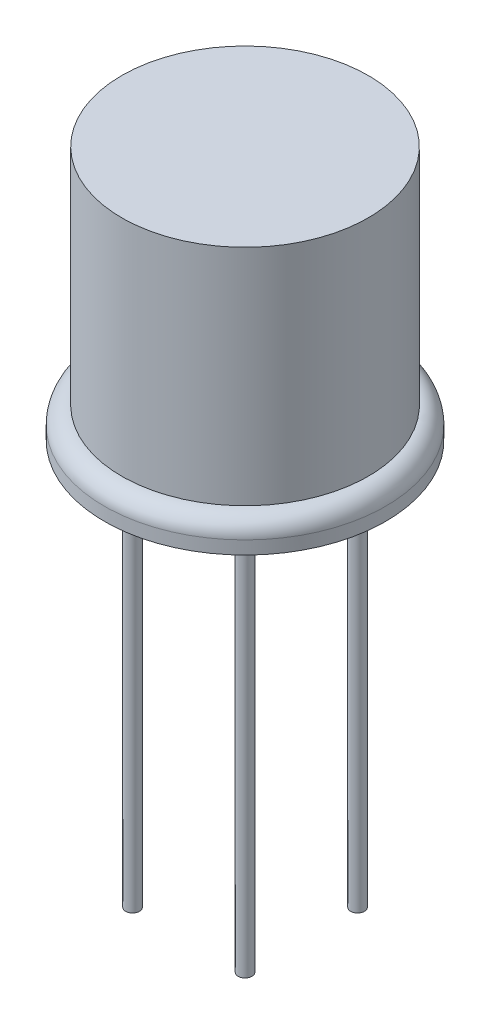
ISO-10303-21;
HEADER;
FILE_DESCRIPTION(('STEP AP214'),'2;1');
FILE_NAME('part.step','',(''),(''),'','','');
FILE_SCHEMA(('AUTOMOTIVE_DESIGN { 1 0 10303 214 1 1 1 1 }'));
ENDSEC;
DATA;
#1=APPLICATION_CONTEXT('core data for automotive mechanical design processes');
#2=APPLICATION_PROTOCOL_DEFINITION('international standard','automotive_design',2000,#1);
#3=PRODUCT_CONTEXT('',#1,'mechanical');
#4=PRODUCT('Part','Part','',(#3));
#5=PRODUCT_RELATED_PRODUCT_CATEGORY('part','',(#4));
#6=PRODUCT_DEFINITION_FORMATION('','',#4);
#7=PRODUCT_DEFINITION_CONTEXT('part definition',#1,'design');
#8=PRODUCT_DEFINITION('design','',#6,#7);
#9=PRODUCT_DEFINITION_SHAPE('','',#8);
#10=(LENGTH_UNIT() NAMED_UNIT(*) SI_UNIT(.MILLI.,.METRE.));
#11=(NAMED_UNIT(*) PLANE_ANGLE_UNIT() SI_UNIT($,.RADIAN.));
#12=(NAMED_UNIT(*) SI_UNIT($,.STERADIAN.) SOLID_ANGLE_UNIT());
#13=UNCERTAINTY_MEASURE_WITH_UNIT(LENGTH_MEASURE(1.E-05),#10,'distance_accuracy_value','');
#14=(GEOMETRIC_REPRESENTATION_CONTEXT(3) GLOBAL_UNCERTAINTY_ASSIGNED_CONTEXT((#13)) GLOBAL_UNIT_ASSIGNED_CONTEXT((#10,
#11,#12)) REPRESENTATION_CONTEXT('',''));
#15=CARTESIAN_POINT('',(0.,0.,0.));
#16=DIRECTION('',(0.,0.,1.));
#17=DIRECTION('',(1.,0.,0.));
#18=AXIS2_PLACEMENT_3D('',#15,#16,#17);
#19=CARTESIAN_POINT('',(0.,0.4318,0.));
#20=DIRECTION('',(0.,1.,0.));
#21=DIRECTION('',(0.,0.,1.));
#22=AXIS2_PLACEMENT_3D('',#19,#20,#21);
#23=PLANE('',#22);
#24=DIRECTION('',(0.,0.,1.));
#25=VECTOR('',#24,1.);
#26=CARTESIAN_POINT('',(-0.4445,0.4318,-4.61413913964458));
#27=LINE('',#26,#25);
#28=CARTESIAN_POINT('',(-0.4445,0.4318,-5.24913913964458));
#29=VERTEX_POINT('',#28);
#30=CARTESIAN_POINT('',(-0.4445,0.4318,-4.61413913964458));
#31=VERTEX_POINT('',#30);
#32=EDGE_CURVE('E63',#29,#31,#27,.T.);
#33=ORIENTED_EDGE('',*,*,#32,.T.);
#34=CARTESIAN_POINT('',(0.,0.4318,0.));
#35=DIRECTION('',(0.,1.,0.));
#36=DIRECTION('',(-1.,0.,0.));
#37=AXIS2_PLACEMENT_3D('',#34,#35,#36);
#38=CIRCLE('',#37,4.6355);
#39=CARTESIAN_POINT('',(0.4445,0.4318,-4.61413913964458));
#40=VERTEX_POINT('',#39);
#41=EDGE_CURVE('E114',#40,#31,#38,.T.);
#42=ORIENTED_EDGE('',*,*,#41,.F.);
#43=DIRECTION('',(0.,0.,-1.));
#44=VECTOR('',#43,1.);
#45=CARTESIAN_POINT('',(0.4445,0.4318,-5.24913913964458));
#46=LINE('',#45,#44);
#47=CARTESIAN_POINT('',(0.4445,0.4318,-5.24913913964458));
#48=VERTEX_POINT('',#47);
#49=EDGE_CURVE('E90',#40,#48,#46,.T.);
#50=ORIENTED_EDGE('',*,*,#49,.T.);
#51=DIRECTION('',(-1.,0.,0.));
#52=VECTOR('',#51,1.);
#53=CARTESIAN_POINT('',(-0.4445,0.4318,-5.24913913964458));
#54=LINE('',#53,#52);
#55=EDGE_CURVE('E112',#48,#29,#54,.T.);
#56=ORIENTED_EDGE('',*,*,#55,.T.);
#57=EDGE_LOOP('',(#33,#42,#50,#56));
#58=FACE_BOUND('',#57,.T.);
#59=ADVANCED_FACE('F45',(#58),#23,.T.);
#60=CARTESIAN_POINT('',(0.,0.4318,0.));
#61=DIRECTION('',(0.,-1.,0.));
#62=DIRECTION('',(0.,0.,-1.));
#63=AXIS2_PLACEMENT_3D('',#60,#61,#62);
#64=CYLINDRICAL_SURFACE('',#63,4.6355);
#65=CARTESIAN_POINT('',(0.,0.,0.));
#66=DIRECTION('',(0.,1.,0.));
#67=DIRECTION('',(0.,0.,1.));
#68=AXIS2_PLACEMENT_3D('',#65,#66,#67);
#69=CIRCLE('',#68,4.6355);
#70=CARTESIAN_POINT('',(-0.4445,0.,-4.61413913964458));
#71=VERTEX_POINT('',#70);
#72=CARTESIAN_POINT('',(0.4445,0.,-4.61413913964458));
#73=VERTEX_POINT('',#72);
#74=EDGE_CURVE('E103',#71,#73,#69,.T.);
#75=ORIENTED_EDGE('',*,*,#74,.T.);
#76=DIRECTION('',(0.,-1.,0.));
#77=VECTOR('',#76,1.);
#78=CARTESIAN_POINT('',(0.4445,0.4318,-4.61413913964458));
#79=LINE('',#78,#77);
#80=EDGE_CURVE('E98',#40,#73,#79,.T.);
#81=ORIENTED_EDGE('',*,*,#80,.F.);
#82=CARTESIAN_POINT('',(0.,0.4318,0.));
#83=DIRECTION('',(0.,1.,0.));
#84=DIRECTION('',(0.,0.,1.));
#85=AXIS2_PLACEMENT_3D('',#82,#83,#84);
#86=CIRCLE('',#85,4.6355);
#87=EDGE_CURVE('E100',#31,#40,#86,.T.);
#88=ORIENTED_EDGE('',*,*,#87,.F.);
#89=DIRECTION('',(0.,-1.,0.));
#90=VECTOR('',#89,1.);
#91=CARTESIAN_POINT('',(-0.4445,0.4318,-4.61413913964458));
#92=LINE('',#91,#90);
#93=EDGE_CURVE('E133',#31,#71,#92,.T.);
#94=ORIENTED_EDGE('',*,*,#93,.T.);
#95=EDGE_LOOP('',(#75,#81,#88,#94));
#96=FACE_BOUND('',#95,.T.);
#97=ADVANCED_FACE('F47',(#96),#64,.T.);
#98=CARTESIAN_POINT('',(0.4445,0.4318,-5.24913913964458));
#99=DIRECTION('',(-1.,0.,0.));
#100=DIRECTION('',(0.,0.,1.));
#101=AXIS2_PLACEMENT_3D('',#98,#99,#100);
#102=PLANE('',#101);
#103=DIRECTION('',(0.,0.,-1.));
#104=VECTOR('',#103,1.);
#105=CARTESIAN_POINT('',(0.4445,0.,-5.24913913964458));
#106=LINE('',#105,#104);
#107=CARTESIAN_POINT('',(0.4445,0.,-5.24913913964458));
#108=VERTEX_POINT('',#107);
#109=EDGE_CURVE('E136',#73,#108,#106,.T.);
#110=ORIENTED_EDGE('',*,*,#109,.T.);
#111=DIRECTION('',(0.,-1.,0.));
#112=VECTOR('',#111,1.);
#113=CARTESIAN_POINT('',(0.4445,0.4318,-5.24913913964458));
#114=LINE('',#113,#112);
#115=EDGE_CURVE('E107',#48,#108,#114,.T.);
#116=ORIENTED_EDGE('',*,*,#115,.F.);
#117=ORIENTED_EDGE('',*,*,#49,.F.);
#118=ORIENTED_EDGE('',*,*,#80,.T.);
#119=EDGE_LOOP('',(#110,#116,#117,#118));
#120=FACE_BOUND('',#119,.T.);
#121=ADVANCED_FACE('F109',(#120),#102,.F.);
#122=CARTESIAN_POINT('',(-0.4445,0.4318,-5.24913913964458));
#123=DIRECTION('',(0.,0.,1.));
#124=DIRECTION('',(1.,0.,0.));
#125=AXIS2_PLACEMENT_3D('',#122,#123,#124);
#126=PLANE('',#125);
#127=DIRECTION('',(-1.,0.,0.));
#128=VECTOR('',#127,1.);
#129=CARTESIAN_POINT('',(-0.4445,0.,-5.24913913964458));
#130=LINE('',#129,#128);
#131=CARTESIAN_POINT('',(-0.4445,0.,-5.24913913964458));
#132=VERTEX_POINT('',#131);
#133=EDGE_CURVE('E81',#108,#132,#130,.T.);
#134=ORIENTED_EDGE('',*,*,#133,.T.);
#135=DIRECTION('',(0.,-1.,0.));
#136=VECTOR('',#135,1.);
#137=CARTESIAN_POINT('',(-0.4445,0.4318,-5.24913913964458));
#138=LINE('',#137,#136);
#139=EDGE_CURVE('E143',#29,#132,#138,.T.);
#140=ORIENTED_EDGE('',*,*,#139,.F.);
#141=ORIENTED_EDGE('',*,*,#55,.F.);
#142=ORIENTED_EDGE('',*,*,#115,.T.);
#143=EDGE_LOOP('',(#134,#140,#141,#142));
#144=FACE_BOUND('',#143,.T.);
#145=ADVANCED_FACE('F170',(#144),#126,.F.);
#146=CARTESIAN_POINT('',(-0.4445,0.4318,-4.61413913964458));
#147=DIRECTION('',(1.,0.,0.));
#148=DIRECTION('',(0.,0.,-1.));
#149=AXIS2_PLACEMENT_3D('',#146,#147,#148);
#150=PLANE('',#149);
#151=DIRECTION('',(0.,0.,1.));
#152=VECTOR('',#151,1.);
#153=CARTESIAN_POINT('',(-0.4445,0.,-4.61413913964458));
#154=LINE('',#153,#152);
#155=EDGE_CURVE('E86',#132,#71,#154,.T.);
#156=ORIENTED_EDGE('',*,*,#155,.T.);
#157=ORIENTED_EDGE('',*,*,#93,.F.);
#158=ORIENTED_EDGE('',*,*,#32,.F.);
#159=ORIENTED_EDGE('',*,*,#139,.T.);
#160=EDGE_LOOP('',(#156,#157,#158,#159));
#161=FACE_BOUND('',#160,.T.);
#162=ADVANCED_FACE('F163',(#161),#150,.F.);
#163=CARTESIAN_POINT('',(0.,0.,0.));
#164=DIRECTION('',(0.,1.,0.));
#165=DIRECTION('',(0.,0.,1.));
#166=AXIS2_PLACEMENT_3D('',#163,#164,#165);
#167=PLANE('',#166);
#168=CARTESIAN_POINT('',(-1.8542,0.,1.8542));
#169=DIRECTION('',(0.,1.,0.));
#170=DIRECTION('',(0.,0.,1.));
#171=AXIS2_PLACEMENT_3D('',#168,#169,#170);
#172=CIRCLE('',#171,0.2286);
#173=CARTESIAN_POINT('',(-1.8542,0.,2.0828));
#174=VERTEX_POINT('',#173);
#175=EDGE_CURVE('E12',#174,#174,#172,.F.);
#176=ORIENTED_EDGE('',*,*,#175,.F.);
#177=EDGE_LOOP('',(#176));
#178=FACE_BOUND('',#177,.T.);
#179=CARTESIAN_POINT('',(1.8542,0.,1.8542));
#180=DIRECTION('',(0.,1.,0.));
#181=DIRECTION('',(0.,0.,1.));
#182=AXIS2_PLACEMENT_3D('',#179,#180,#181);
#183=CIRCLE('',#182,0.2286);
#184=CARTESIAN_POINT('',(1.8542,0.,2.0828));
#185=VERTEX_POINT('',#184);
#186=EDGE_CURVE('E55',#185,#185,#183,.F.);
#187=ORIENTED_EDGE('',*,*,#186,.F.);
#188=EDGE_LOOP('',(#187));
#189=FACE_BOUND('',#188,.T.);
#190=CARTESIAN_POINT('',(1.8542,0.,-1.8542));
#191=DIRECTION('',(0.,1.,0.));
#192=DIRECTION('',(0.,0.,1.));
#193=AXIS2_PLACEMENT_3D('',#190,#191,#192);
#194=CIRCLE('',#193,0.2286);
#195=CARTESIAN_POINT('',(1.8542,0.,-1.6256));
#196=VERTEX_POINT('',#195);
#197=EDGE_CURVE('E151',#196,#196,#194,.F.);
#198=ORIENTED_EDGE('',*,*,#197,.F.);
#199=EDGE_LOOP('',(#198));
#200=FACE_BOUND('',#199,.T.);
#201=CARTESIAN_POINT('',(-1.8542,0.,-1.8542));
#202=DIRECTION('',(0.,1.,0.));
#203=DIRECTION('',(0.,0.,1.));
#204=AXIS2_PLACEMENT_3D('',#201,#202,#203);
#205=CIRCLE('',#204,0.2286);
#206=CARTESIAN_POINT('',(-1.8542,0.,-1.6256));
#207=VERTEX_POINT('',#206);
#208=EDGE_CURVE('E106',#207,#207,#205,.F.);
#209=ORIENTED_EDGE('',*,*,#208,.F.);
#210=EDGE_LOOP('',(#209));
#211=FACE_BOUND('',#210,.T.);
#212=ORIENTED_EDGE('',*,*,#74,.F.);
#213=ORIENTED_EDGE('',*,*,#155,.F.);
#214=ORIENTED_EDGE('',*,*,#133,.F.);
#215=ORIENTED_EDGE('',*,*,#109,.F.);
#216=EDGE_LOOP('',(#212,#213,#214,#215));
#217=FACE_BOUND('',#216,.T.);
#218=ADVANCED_FACE('F160',(#178,#189,#200,#211,#217),#167,.F.);
#219=CARTESIAN_POINT('',(0.,0.4318,0.));
#220=DIRECTION('',(0.,1.,0.));
#221=DIRECTION('',(-1.,0.,0.));
#222=AXIS2_PLACEMENT_3D('',#219,#220,#221);
#223=TOROIDAL_SURFACE('',#222,4.064,0.5715);
#224=CARTESIAN_POINT('',(0.,1.0033,0.));
#225=DIRECTION('',(0.,1.,0.));
#226=DIRECTION('',(-1.,0.,0.));
#227=AXIS2_PLACEMENT_3D('',#224,#225,#226);
#228=CIRCLE('',#227,4.064);
#229=CARTESIAN_POINT('',(-4.064,1.0033,0.));
#230=VERTEX_POINT('',#229);
#231=EDGE_CURVE('E126',#230,#230,#228,.T.);
#232=ORIENTED_EDGE('',*,*,#231,.F.);
#233=EDGE_LOOP('',(#232));
#234=FACE_BOUND('',#233,.T.);
#235=ORIENTED_EDGE('',*,*,#41,.T.);
#236=ORIENTED_EDGE('',*,*,#87,.T.);
#237=EDGE_LOOP('',(#235,#236));
#238=FACE_BOUND('',#237,.T.);
#239=ADVANCED_FACE('F120',(#234,#238),#223,.T.);
#240=CARTESIAN_POINT('',(0.,8.382,0.));
#241=DIRECTION('',(0.,1.,0.));
#242=DIRECTION('',(-1.,0.,0.));
#243=AXIS2_PLACEMENT_3D('',#240,#241,#242);
#244=CYLINDRICAL_SURFACE('',#243,4.064);
#245=CARTESIAN_POINT('',(0.,8.382,0.));
#246=DIRECTION('',(0.,1.,0.));
#247=DIRECTION('',(-1.,0.,0.));
#248=AXIS2_PLACEMENT_3D('',#245,#246,#247);
#249=CIRCLE('',#248,4.064);
#250=CARTESIAN_POINT('',(-4.064,8.382,0.));
#251=VERTEX_POINT('',#250);
#252=EDGE_CURVE('E117',#251,#251,#249,.T.);
#253=ORIENTED_EDGE('',*,*,#252,.F.);
#254=EDGE_LOOP('',(#253));
#255=FACE_BOUND('',#254,.T.);
#256=ORIENTED_EDGE('',*,*,#231,.T.);
#257=EDGE_LOOP('',(#256));
#258=FACE_BOUND('',#257,.T.);
#259=ADVANCED_FACE('F185',(#255,#258),#244,.T.);
#260=CARTESIAN_POINT('',(4.064,8.382,0.));
#261=DIRECTION('',(0.,-1.,0.));
#262=DIRECTION('',(1.,0.,0.));
#263=AXIS2_PLACEMENT_3D('',#260,#261,#262);
#264=PLANE('',#263);
#265=ORIENTED_EDGE('',*,*,#252,.T.);
#266=EDGE_LOOP('',(#265));
#267=FACE_BOUND('',#266,.T.);
#268=ADVANCED_FACE('F189',(#267),#264,.F.);
#269=CARTESIAN_POINT('',(-1.8542,-13.335,-1.8542));
#270=DIRECTION('',(0.,1.,0.));
#271=DIRECTION('',(0.,0.,1.));
#272=AXIS2_PLACEMENT_3D('',#269,#270,#271);
#273=CYLINDRICAL_SURFACE('',#272,0.2286);
#274=CARTESIAN_POINT('',(-1.8542,-13.335,-1.8542));
#275=DIRECTION('',(0.,-1.,0.));
#276=DIRECTION('',(0.,0.,-1.));
#277=AXIS2_PLACEMENT_3D('',#274,#275,#276);
#278=CIRCLE('',#277,0.2286);
#279=CARTESIAN_POINT('',(-1.8542,-13.335,-2.0828));
#280=VERTEX_POINT('',#279);
#281=EDGE_CURVE('E118',#280,#280,#278,.T.);
#282=ORIENTED_EDGE('',*,*,#281,.F.);
#283=EDGE_LOOP('',(#282));
#284=FACE_BOUND('',#283,.T.);
#285=ORIENTED_EDGE('',*,*,#208,.T.);
#286=EDGE_LOOP('',(#285));
#287=FACE_BOUND('',#286,.T.);
#288=ADVANCED_FACE('F193',(#284,#287),#273,.T.);
#289=CARTESIAN_POINT('',(-1.8542,-13.335,-1.8542));
#290=DIRECTION('',(0.,-1.,0.));
#291=DIRECTION('',(0.,0.,-1.));
#292=AXIS2_PLACEMENT_3D('',#289,#290,#291);
#293=PLANE('',#292);
#294=ORIENTED_EDGE('',*,*,#281,.T.);
#295=EDGE_LOOP('',(#294));
#296=FACE_BOUND('',#295,.T.);
#297=ADVANCED_FACE('F197',(#296),#293,.T.);
#298=CARTESIAN_POINT('',(1.8542,-13.335,-1.8542));
#299=DIRECTION('',(0.,1.,0.));
#300=DIRECTION('',(0.,0.,1.));
#301=AXIS2_PLACEMENT_3D('',#298,#299,#300);
#302=CYLINDRICAL_SURFACE('',#301,0.2286);
#303=CARTESIAN_POINT('',(1.8542,-13.335,-1.8542));
#304=DIRECTION('',(0.,-1.,0.));
#305=DIRECTION('',(0.,0.,-1.));
#306=AXIS2_PLACEMENT_3D('',#303,#304,#305);
#307=CIRCLE('',#306,0.2286);
#308=CARTESIAN_POINT('',(1.8542,-13.335,-2.0828));
#309=VERTEX_POINT('',#308);
#310=EDGE_CURVE('E229',#309,#309,#307,.T.);
#311=ORIENTED_EDGE('',*,*,#310,.F.);
#312=EDGE_LOOP('',(#311));
#313=FACE_BOUND('',#312,.T.);
#314=ORIENTED_EDGE('',*,*,#197,.T.);
#315=EDGE_LOOP('',(#314));
#316=FACE_BOUND('',#315,.T.);
#317=ADVANCED_FACE('F201',(#313,#316),#302,.T.);
#318=CARTESIAN_POINT('',(1.8542,-13.335,-1.8542));
#319=DIRECTION('',(0.,-1.,0.));
#320=DIRECTION('',(0.,0.,-1.));
#321=AXIS2_PLACEMENT_3D('',#318,#319,#320);
#322=PLANE('',#321);
#323=ORIENTED_EDGE('',*,*,#310,.T.);
#324=EDGE_LOOP('',(#323));
#325=FACE_BOUND('',#324,.T.);
#326=ADVANCED_FACE('F217',(#325),#322,.T.);
#327=CARTESIAN_POINT('',(1.8542,-13.335,1.8542));
#328=DIRECTION('',(0.,1.,0.));
#329=DIRECTION('',(0.,0.,1.));
#330=AXIS2_PLACEMENT_3D('',#327,#328,#329);
#331=CYLINDRICAL_SURFACE('',#330,0.2286);
#332=CARTESIAN_POINT('',(1.8542,-13.335,1.8542));
#333=DIRECTION('',(0.,-1.,0.));
#334=DIRECTION('',(0.,0.,-1.));
#335=AXIS2_PLACEMENT_3D('',#332,#333,#334);
#336=CIRCLE('',#335,0.2286);
#337=CARTESIAN_POINT('',(1.8542,-13.335,1.6256));
#338=VERTEX_POINT('',#337);
#339=EDGE_CURVE('E231',#338,#338,#336,.T.);
#340=ORIENTED_EDGE('',*,*,#339,.F.);
#341=EDGE_LOOP('',(#340));
#342=FACE_BOUND('',#341,.T.);
#343=ORIENTED_EDGE('',*,*,#186,.T.);
#344=EDGE_LOOP('',(#343));
#345=FACE_BOUND('',#344,.T.);
#346=ADVANCED_FACE('F158',(#342,#345),#331,.T.);
#347=CARTESIAN_POINT('',(1.8542,-13.335,1.8542));
#348=DIRECTION('',(0.,-1.,0.));
#349=DIRECTION('',(0.,0.,-1.));
#350=AXIS2_PLACEMENT_3D('',#347,#348,#349);
#351=PLANE('',#350);
#352=ORIENTED_EDGE('',*,*,#339,.T.);
#353=EDGE_LOOP('',(#352));
#354=FACE_BOUND('',#353,.T.);
#355=ADVANCED_FACE('F210',(#354),#351,.T.);
#356=CARTESIAN_POINT('',(-1.8542,-13.335,1.8542));
#357=DIRECTION('',(0.,1.,0.));
#358=DIRECTION('',(0.,0.,1.));
#359=AXIS2_PLACEMENT_3D('',#356,#357,#358);
#360=CYLINDRICAL_SURFACE('',#359,0.2286);
#361=CARTESIAN_POINT('',(-1.8542,-13.335,1.8542));
#362=DIRECTION('',(0.,-1.,0.));
#363=DIRECTION('',(0.,0.,-1.));
#364=AXIS2_PLACEMENT_3D('',#361,#362,#363);
#365=CIRCLE('',#364,0.2286);
#366=CARTESIAN_POINT('',(-1.8542,-13.335,1.6256));
#367=VERTEX_POINT('',#366);
#368=EDGE_CURVE('E238',#367,#367,#365,.T.);
#369=ORIENTED_EDGE('',*,*,#368,.F.);
#370=EDGE_LOOP('',(#369));
#371=FACE_BOUND('',#370,.T.);
#372=ORIENTED_EDGE('',*,*,#175,.T.);
#373=EDGE_LOOP('',(#372));
#374=FACE_BOUND('',#373,.T.);
#375=ADVANCED_FACE('F206',(#371,#374),#360,.T.);
#376=CARTESIAN_POINT('',(-1.8542,-13.335,1.8542));
#377=DIRECTION('',(0.,-1.,0.));
#378=DIRECTION('',(0.,0.,-1.));
#379=AXIS2_PLACEMENT_3D('',#376,#377,#378);
#380=PLANE('',#379);
#381=ORIENTED_EDGE('',*,*,#368,.T.);
#382=EDGE_LOOP('',(#381));
#383=FACE_BOUND('',#382,.T.);
#384=ADVANCED_FACE('F203',(#383),#380,.T.);
#385=CLOSED_SHELL('',(#59,#97,#121,#145,#162,#218,#239,#259,#268,#288,#297,#317,#326,#346,#355,
#375,#384));
#386=MANIFOLD_SOLID_BREP('B2',#385);
#387=ADVANCED_BREP_SHAPE_REPRESENTATION('',(#18,#386),#14);
#388=SHAPE_DEFINITION_REPRESENTATION(#9,#387);
ENDSEC;
END-ISO-10303-21;
